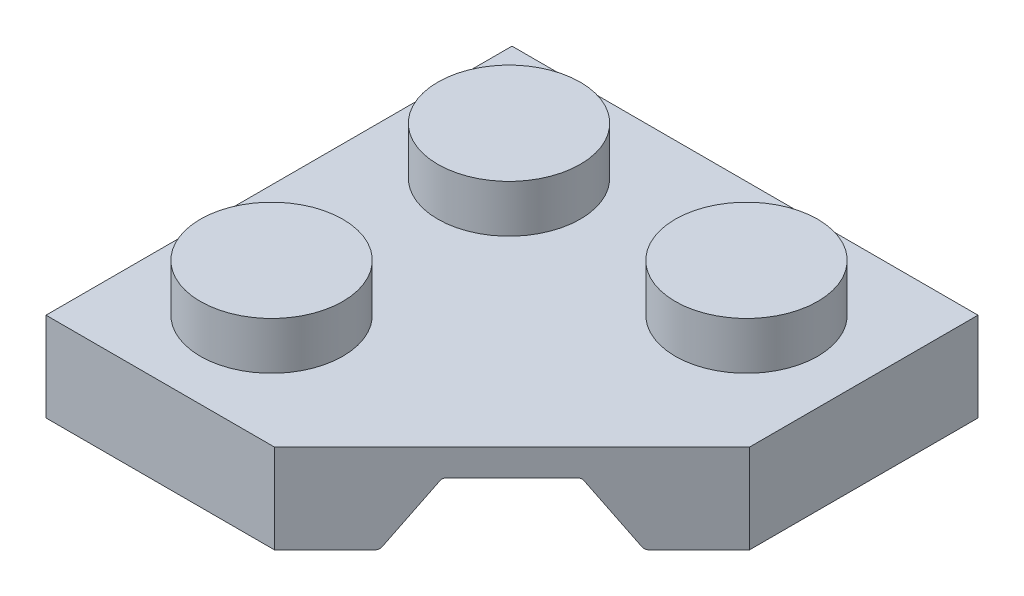
ISO-10303-21;
HEADER;
FILE_DESCRIPTION(('STEP AP214'),'2;1');
FILE_NAME('part.step','',(''),(''),'','','');
FILE_SCHEMA(('AUTOMOTIVE_DESIGN { 1 0 10303 214 1 1 1 1 }'));
ENDSEC;
DATA;
#1=APPLICATION_CONTEXT('core data for automotive mechanical design processes');
#2=APPLICATION_PROTOCOL_DEFINITION('international standard','automotive_design',2000,#1);
#3=PRODUCT_CONTEXT('',#1,'mechanical');
#4=PRODUCT('Part','Part','',(#3));
#5=PRODUCT_RELATED_PRODUCT_CATEGORY('part','',(#4));
#6=PRODUCT_DEFINITION_FORMATION('','',#4);
#7=PRODUCT_DEFINITION_CONTEXT('part definition',#1,'design');
#8=PRODUCT_DEFINITION('design','',#6,#7);
#9=PRODUCT_DEFINITION_SHAPE('','',#8);
#10=(LENGTH_UNIT() NAMED_UNIT(*) SI_UNIT(.MILLI.,.METRE.));
#11=(NAMED_UNIT(*) PLANE_ANGLE_UNIT() SI_UNIT($,.RADIAN.));
#12=(NAMED_UNIT(*) SI_UNIT($,.STERADIAN.) SOLID_ANGLE_UNIT());
#13=UNCERTAINTY_MEASURE_WITH_UNIT(LENGTH_MEASURE(1.E-05),#10,'distance_accuracy_value','');
#14=(GEOMETRIC_REPRESENTATION_CONTEXT(3) GLOBAL_UNCERTAINTY_ASSIGNED_CONTEXT((#13)) GLOBAL_UNIT_ASSIGNED_CONTEXT((#10,
#11,#12)) REPRESENTATION_CONTEXT('',''));
#15=CARTESIAN_POINT('',(0.,0.,0.));
#16=DIRECTION('',(0.,0.,1.));
#17=DIRECTION('',(1.,0.,0.));
#18=AXIS2_PLACEMENT_3D('',#15,#16,#17);
#19=CARTESIAN_POINT('',(-1.15,21.7232539419353,7.15));
#20=DIRECTION('',(0.707106781186547,0.,0.707106781186547));
#21=DIRECTION('',(0.707106781186548,0.,-0.707106781186548));
#22=AXIS2_PLACEMENT_3D('',#19,#20,#21);
#23=PLANE('',#22);
#24=DIRECTION('',(-0.707106781186547,0.,0.707106781186547));
#25=VECTOR('',#24,1.);
#26=CARTESIAN_POINT('',(-1.15,-1.5,7.15));
#27=LINE('',#26,#25);
#28=CARTESIAN_POINT('',(7.15,-1.5,-1.15));
#29=VERTEX_POINT('',#28);
#30=CARTESIAN_POINT('',(5.30648287030593,-1.5,0.693517129694073));
#31=VERTEX_POINT('',#30);
#32=EDGE_CURVE('E342',#29,#31,#27,.T.);
#33=ORIENTED_EDGE('',*,*,#32,.T.);
#34=CARTESIAN_POINT('',(5.30648287030593,-1.3,0.693517129694073));
#35=DIRECTION('',(0.707106781186547,0.,0.707106781186547));
#36=DIRECTION('',(0.707106781186548,0.,-0.707106781186548));
#37=AXIS2_PLACEMENT_3D('',#34,#35,#36);
#38=CIRCLE('',#37,0.2);
#39=CARTESIAN_POINT('',(5.19140357919218,-1.41624763874382,0.808596420807821));
#40=VERTEX_POINT('',#39);
#41=EDGE_CURVE('E248',#31,#40,#38,.F.);
#42=ORIENTED_EDGE('',*,*,#41,.T.);
#43=DIRECTION('',(-0.410997468263393,0.813733471206735,0.410997468263393));
#44=VECTOR('',#43,1.);
#45=CARTESIAN_POINT('',(-4.68979285748255,18.1475231797615,10.6897928574826));
#46=LINE('',#45,#44);
#47=CARTESIAN_POINT('',(4.21534606824754,0.516247638743816,1.78465393175246));
#48=VERTEX_POINT('',#47);
#49=EDGE_CURVE('E275',#40,#48,#46,.T.);
#50=ORIENTED_EDGE('',*,*,#49,.T.);
#51=CARTESIAN_POINT('',(4.10026677713379,0.4,1.89973322286621));
#52=DIRECTION('',(0.707106781186547,0.,0.707106781186547));
#53=DIRECTION('',(0.707106781186548,0.,-0.707106781186548));
#54=AXIS2_PLACEMENT_3D('',#51,#52,#53);
#55=CIRCLE('',#54,0.2);
#56=CARTESIAN_POINT('',(4.10026677713379,0.6,1.89973322286621));
#57=VERTEX_POINT('',#56);
#58=EDGE_CURVE('E260',#48,#57,#55,.T.);
#59=ORIENTED_EDGE('',*,*,#58,.T.);
#60=DIRECTION('',(0.707106781186548,0.,-0.707106781186548));
#61=VECTOR('',#60,1.);
#62=CARTESIAN_POINT('',(-1.15,0.6,7.15));
#63=LINE('',#62,#61);
#64=CARTESIAN_POINT('',(7.15,0.6,-1.15));
#65=VERTEX_POINT('',#64);
#66=EDGE_CURVE('E56',#57,#65,#63,.T.);
#67=ORIENTED_EDGE('',*,*,#66,.T.);
#68=DIRECTION('',(0.,-1.,0.));
#69=VECTOR('',#68,1.);
#70=CARTESIAN_POINT('',(7.15,21.7232539419353,-1.15));
#71=LINE('',#70,#69);
#72=EDGE_CURVE('E353',#65,#29,#71,.T.);
#73=ORIENTED_EDGE('',*,*,#72,.T.);
#74=EDGE_LOOP('',(#33,#42,#50,#59,#67,#73));
#75=FACE_BOUND('',#74,.T.);
#76=ADVANCED_FACE('F41',(#75),#23,.F.);
#77=CARTESIAN_POINT('',(-4.05,3.1,4.05000000000001));
#78=DIRECTION('',(0.,1.,0.));
#79=DIRECTION('',(0.,0.,1.));
#80=AXIS2_PLACEMENT_3D('',#77,#78,#79);
#81=PLANE('',#80);
#82=CARTESIAN_POINT('',(-4.05,3.1,4.05000000000001));
#83=DIRECTION('',(0.,1.,0.));
#84=DIRECTION('',(0.,0.,1.));
#85=AXIS2_PLACEMENT_3D('',#82,#83,#84);
#86=CIRCLE('',#85,2.4);
#87=CARTESIAN_POINT('',(-4.05,3.1,6.45));
#88=VERTEX_POINT('',#87);
#89=EDGE_CURVE('E228',#88,#88,#86,.T.);
#90=ORIENTED_EDGE('',*,*,#89,.T.);
#91=EDGE_LOOP('',(#90));
#92=FACE_BOUND('',#91,.T.);
#93=ADVANCED_FACE('F417',(#92),#81,.T.);
#94=CARTESIAN_POINT('',(-4.05,3.1,4.05000000000001));
#95=DIRECTION('',(0.,-1.,0.));
#96=DIRECTION('',(0.,0.,-1.));
#97=AXIS2_PLACEMENT_3D('',#94,#95,#96);
#98=CYLINDRICAL_SURFACE('',#97,2.4);
#99=ORIENTED_EDGE('',*,*,#89,.F.);
#100=EDGE_LOOP('',(#99));
#101=FACE_BOUND('',#100,.T.);
#102=CARTESIAN_POINT('',(-4.05,1.5,4.05000000000001));
#103=DIRECTION('',(0.,-1.,0.));
#104=DIRECTION('',(0.,0.,-1.));
#105=AXIS2_PLACEMENT_3D('',#102,#103,#104);
#106=CIRCLE('',#105,2.4);
#107=CARTESIAN_POINT('',(-4.05,1.5,1.65000000000001));
#108=VERTEX_POINT('',#107);
#109=EDGE_CURVE('E225',#108,#108,#106,.F.);
#110=ORIENTED_EDGE('',*,*,#109,.T.);
#111=EDGE_LOOP('',(#110));
#112=FACE_BOUND('',#111,.T.);
#113=ADVANCED_FACE('F422',(#101,#112),#98,.T.);
#114=CARTESIAN_POINT('',(7.85,1.5,7.85));
#115=DIRECTION('',(-1.,0.,0.));
#116=DIRECTION('',(0.,0.,1.));
#117=AXIS2_PLACEMENT_3D('',#114,#115,#116);
#118=PLANE('',#117);
#119=DIRECTION('',(0.,0.,-1.));
#120=VECTOR('',#119,1.);
#121=CARTESIAN_POINT('',(7.85,1.5,7.85));
#122=LINE('',#121,#120);
#123=CARTESIAN_POINT('',(7.85,1.5,-0.152943725152281));
#124=VERTEX_POINT('',#123);
#125=CARTESIAN_POINT('',(7.85,1.5,-7.85));
#126=VERTEX_POINT('',#125);
#127=EDGE_CURVE('E187',#124,#126,#122,.T.);
#128=ORIENTED_EDGE('',*,*,#127,.F.);
#129=DIRECTION('',(0.,-1.,0.));
#130=VECTOR('',#129,1.);
#131=CARTESIAN_POINT('',(7.85,3.1,-0.152943725152281));
#132=LINE('',#131,#130);
#133=CARTESIAN_POINT('',(7.85,-1.5,-0.152943725152281));
#134=VERTEX_POINT('',#133);
#135=EDGE_CURVE('E169',#124,#134,#132,.T.);
#136=ORIENTED_EDGE('',*,*,#135,.T.);
#137=DIRECTION('',(0.,0.,-1.));
#138=VECTOR('',#137,1.);
#139=CARTESIAN_POINT('',(7.85,-1.5,7.85));
#140=LINE('',#139,#138);
#141=CARTESIAN_POINT('',(7.85,-1.5,-7.85));
#142=VERTEX_POINT('',#141);
#143=EDGE_CURVE('E185',#134,#142,#140,.T.);
#144=ORIENTED_EDGE('',*,*,#143,.T.);
#145=DIRECTION('',(0.,-1.,0.));
#146=VECTOR('',#145,1.);
#147=CARTESIAN_POINT('',(7.85,1.5,-7.85));
#148=LINE('',#147,#146);
#149=EDGE_CURVE('E217',#126,#142,#148,.T.);
#150=ORIENTED_EDGE('',*,*,#149,.F.);
#151=EDGE_LOOP('',(#128,#136,#144,#150));
#152=FACE_BOUND('',#151,.T.);
#153=ADVANCED_FACE('F183',(#152),#118,.F.);
#154=CARTESIAN_POINT('',(-7.85,1.5,-7.85));
#155=DIRECTION('',(0.,0.,1.));
#156=DIRECTION('',(1.,0.,0.));
#157=AXIS2_PLACEMENT_3D('',#154,#155,#156);
#158=PLANE('',#157);
#159=DIRECTION('',(-1.,0.,0.));
#160=VECTOR('',#159,1.);
#161=CARTESIAN_POINT('',(-7.85,-1.5,-7.85));
#162=LINE('',#161,#160);
#163=CARTESIAN_POINT('',(-7.85,-1.5,-7.85));
#164=VERTEX_POINT('',#163);
#165=EDGE_CURVE('E194',#142,#164,#162,.T.);
#166=ORIENTED_EDGE('',*,*,#165,.T.);
#167=DIRECTION('',(0.,-1.,0.));
#168=VECTOR('',#167,1.);
#169=CARTESIAN_POINT('',(-7.85,1.5,-7.85));
#170=LINE('',#169,#168);
#171=CARTESIAN_POINT('',(-7.85,1.5,-7.85));
#172=VERTEX_POINT('',#171);
#173=EDGE_CURVE('E214',#172,#164,#170,.T.);
#174=ORIENTED_EDGE('',*,*,#173,.F.);
#175=DIRECTION('',(-1.,0.,0.));
#176=VECTOR('',#175,1.);
#177=CARTESIAN_POINT('',(-7.85,1.5,-7.85));
#178=LINE('',#177,#176);
#179=EDGE_CURVE('E361',#126,#172,#178,.T.);
#180=ORIENTED_EDGE('',*,*,#179,.F.);
#181=ORIENTED_EDGE('',*,*,#149,.T.);
#182=EDGE_LOOP('',(#166,#174,#180,#181));
#183=FACE_BOUND('',#182,.T.);
#184=ADVANCED_FACE('F690',(#183),#158,.F.);
#185=CARTESIAN_POINT('',(-7.85,1.5,7.85));
#186=DIRECTION('',(1.,0.,0.));
#187=DIRECTION('',(0.,0.,-1.));
#188=AXIS2_PLACEMENT_3D('',#185,#186,#187);
#189=PLANE('',#188);
#190=DIRECTION('',(0.,0.,1.));
#191=VECTOR('',#190,1.);
#192=CARTESIAN_POINT('',(-7.85,-1.5,7.85));
#193=LINE('',#192,#191);
#194=CARTESIAN_POINT('',(-7.85,-1.5,7.85));
#195=VERTEX_POINT('',#194);
#196=EDGE_CURVE('E198',#164,#195,#193,.T.);
#197=ORIENTED_EDGE('',*,*,#196,.T.);
#198=DIRECTION('',(0.,-1.,0.));
#199=VECTOR('',#198,1.);
#200=CARTESIAN_POINT('',(-7.85,1.5,7.85));
#201=LINE('',#200,#199);
#202=CARTESIAN_POINT('',(-7.85,1.5,7.85));
#203=VERTEX_POINT('',#202);
#204=EDGE_CURVE('E211',#203,#195,#201,.T.);
#205=ORIENTED_EDGE('',*,*,#204,.F.);
#206=DIRECTION('',(0.,0.,1.));
#207=VECTOR('',#206,1.);
#208=CARTESIAN_POINT('',(-7.85,1.5,7.85));
#209=LINE('',#208,#207);
#210=EDGE_CURVE('E362',#172,#203,#209,.T.);
#211=ORIENTED_EDGE('',*,*,#210,.F.);
#212=ORIENTED_EDGE('',*,*,#173,.T.);
#213=EDGE_LOOP('',(#197,#205,#211,#212));
#214=FACE_BOUND('',#213,.T.);
#215=ADVANCED_FACE('F683',(#214),#189,.F.);
#216=CARTESIAN_POINT('',(-7.85,1.5,7.85));
#217=DIRECTION('',(0.,0.,-1.));
#218=DIRECTION('',(-1.,0.,0.));
#219=AXIS2_PLACEMENT_3D('',#216,#217,#218);
#220=PLANE('',#219);
#221=DIRECTION('',(1.,0.,0.));
#222=VECTOR('',#221,1.);
#223=CARTESIAN_POINT('',(-7.85,-1.5,7.85));
#224=LINE('',#223,#222);
#225=CARTESIAN_POINT('',(-0.152943725152292,-1.5,7.85));
#226=VERTEX_POINT('',#225);
#227=EDGE_CURVE('E208',#195,#226,#224,.T.);
#228=ORIENTED_EDGE('',*,*,#227,.T.);
#229=DIRECTION('',(0.,-1.,0.));
#230=VECTOR('',#229,1.);
#231=CARTESIAN_POINT('',(-0.152943725152292,3.1,7.85));
#232=LINE('',#231,#230);
#233=CARTESIAN_POINT('',(-0.152943725152292,1.5,7.85));
#234=VERTEX_POINT('',#233);
#235=EDGE_CURVE('E189',#234,#226,#232,.T.);
#236=ORIENTED_EDGE('',*,*,#235,.F.);
#237=DIRECTION('',(1.,0.,0.));
#238=VECTOR('',#237,1.);
#239=CARTESIAN_POINT('',(-7.85,1.5,7.85));
#240=LINE('',#239,#238);
#241=EDGE_CURVE('E204',#203,#234,#240,.T.);
#242=ORIENTED_EDGE('',*,*,#241,.F.);
#243=ORIENTED_EDGE('',*,*,#204,.T.);
#244=EDGE_LOOP('',(#228,#236,#242,#243));
#245=FACE_BOUND('',#244,.T.);
#246=ADVANCED_FACE('F372',(#245),#220,.F.);
#247=CARTESIAN_POINT('',(0.,1.5,0.));
#248=DIRECTION('',(0.,-1.,0.));
#249=DIRECTION('',(0.,0.,-1.));
#250=AXIS2_PLACEMENT_3D('',#247,#248,#249);
#251=PLANE('',#250);
#252=CARTESIAN_POINT('',(-4.05,1.5,-3.94999999999999));
#253=DIRECTION('',(0.,-1.,0.));
#254=DIRECTION('',(0.,0.,-1.));
#255=AXIS2_PLACEMENT_3D('',#252,#253,#254);
#256=CIRCLE('',#255,2.4);
#257=CARTESIAN_POINT('',(-4.05,1.5,-6.34999999999999));
#258=VERTEX_POINT('',#257);
#259=EDGE_CURVE('E222',#258,#258,#256,.F.);
#260=ORIENTED_EDGE('',*,*,#259,.F.);
#261=EDGE_LOOP('',(#260));
#262=FACE_BOUND('',#261,.T.);
#263=CARTESIAN_POINT('',(3.95,1.5,-3.94999999999999));
#264=DIRECTION('',(0.,-1.,0.));
#265=DIRECTION('',(0.,0.,-1.));
#266=AXIS2_PLACEMENT_3D('',#263,#264,#265);
#267=CIRCLE('',#266,2.4);
#268=CARTESIAN_POINT('',(3.95,1.5,-6.34999999999999));
#269=VERTEX_POINT('',#268);
#270=EDGE_CURVE('E219',#269,#269,#267,.F.);
#271=ORIENTED_EDGE('',*,*,#270,.F.);
#272=EDGE_LOOP('',(#271));
#273=FACE_BOUND('',#272,.T.);
#274=ORIENTED_EDGE('',*,*,#241,.T.);
#275=DIRECTION('',(0.707106781186548,0.,-0.707106781186547));
#276=VECTOR('',#275,1.);
#277=CARTESIAN_POINT('',(3.84852813742386,1.5,3.84852813742386));
#278=LINE('',#277,#276);
#279=EDGE_CURVE('E188',#234,#124,#278,.T.);
#280=ORIENTED_EDGE('',*,*,#279,.T.);
#281=ORIENTED_EDGE('',*,*,#127,.T.);
#282=ORIENTED_EDGE('',*,*,#179,.T.);
#283=ORIENTED_EDGE('',*,*,#210,.T.);
#284=EDGE_LOOP('',(#274,#280,#281,#282,#283));
#285=FACE_BOUND('',#284,.T.);
#286=ORIENTED_EDGE('',*,*,#109,.F.);
#287=EDGE_LOOP('',(#286));
#288=FACE_BOUND('',#287,.T.);
#289=ADVANCED_FACE('F368',(#262,#273,#285,#288),#251,.F.);
#290=CARTESIAN_POINT('',(0.,-1.5,0.));
#291=DIRECTION('',(0.,-1.,0.));
#292=DIRECTION('',(0.,0.,-1.));
#293=AXIS2_PLACEMENT_3D('',#290,#291,#292);
#294=PLANE('',#293);
#295=CARTESIAN_POINT('',(0.693517129694063,-1.5,5.30648287030594));
#296=VERTEX_POINT('',#295);
#297=CARTESIAN_POINT('',(-1.15,-1.5,7.15));
#298=VERTEX_POINT('',#297);
#299=EDGE_CURVE('E341',#296,#298,#27,.T.);
#300=ORIENTED_EDGE('',*,*,#299,.F.);
#301=DIRECTION('',(-0.707106781186547,0.,-0.707106781186548));
#302=VECTOR('',#301,1.);
#303=CARTESIAN_POINT('',(1.54204526711792,-1.5,6.1550110077298));
#304=LINE('',#303,#302);
#305=CARTESIAN_POINT('',(1.54204526711792,-1.5,6.15501100772979));
#306=VERTEX_POINT('',#305);
#307=EDGE_CURVE('E243',#296,#306,#304,.F.);
#308=ORIENTED_EDGE('',*,*,#307,.T.);
#309=DIRECTION('',(0.707106781186548,0.,-0.707106781186547));
#310=VECTOR('',#309,1.);
#311=CARTESIAN_POINT('',(-0.152943725152292,-1.5,7.85));
#312=LINE('',#311,#310);
#313=EDGE_CURVE('E178',#226,#306,#312,.T.);
#314=ORIENTED_EDGE('',*,*,#313,.F.);
#315=ORIENTED_EDGE('',*,*,#227,.F.);
#316=ORIENTED_EDGE('',*,*,#196,.F.);
#317=ORIENTED_EDGE('',*,*,#165,.F.);
#318=ORIENTED_EDGE('',*,*,#143,.F.);
#319=CARTESIAN_POINT('',(6.15501100772978,-1.5,1.54204526711793));
#320=VERTEX_POINT('',#319);
#321=EDGE_CURVE('E165',#320,#134,#312,.T.);
#322=ORIENTED_EDGE('',*,*,#321,.F.);
#323=DIRECTION('',(-0.707106781186547,0.,-0.707106781186548));
#324=VECTOR('',#323,1.);
#325=CARTESIAN_POINT('',(5.30648287030593,-1.5,0.693517129694076));
#326=LINE('',#325,#324);
#327=EDGE_CURVE('E241',#320,#31,#326,.T.);
#328=ORIENTED_EDGE('',*,*,#327,.T.);
#329=ORIENTED_EDGE('',*,*,#32,.F.);
#330=DIRECTION('',(0.,0.,1.));
#331=VECTOR('',#330,1.);
#332=CARTESIAN_POINT('',(7.15,-1.5,-1.15));
#333=LINE('',#332,#331);
#334=CARTESIAN_POINT('',(7.15,-1.5,-7.15));
#335=VERTEX_POINT('',#334);
#336=EDGE_CURVE('E338',#335,#29,#333,.T.);
#337=ORIENTED_EDGE('',*,*,#336,.F.);
#338=DIRECTION('',(1.,0.,0.));
#339=VECTOR('',#338,1.);
#340=CARTESIAN_POINT('',(7.15,-1.5,-7.15));
#341=LINE('',#340,#339);
#342=CARTESIAN_POINT('',(-7.15,-1.5,-7.15));
#343=VERTEX_POINT('',#342);
#344=EDGE_CURVE('E335',#343,#335,#341,.T.);
#345=ORIENTED_EDGE('',*,*,#344,.F.);
#346=DIRECTION('',(0.,0.,-1.));
#347=VECTOR('',#346,1.);
#348=CARTESIAN_POINT('',(-7.15,-1.5,-7.15));
#349=LINE('',#348,#347);
#350=CARTESIAN_POINT('',(-7.15,-1.5,7.15));
#351=VERTEX_POINT('',#350);
#352=EDGE_CURVE('E325',#351,#343,#349,.T.);
#353=ORIENTED_EDGE('',*,*,#352,.F.);
#354=DIRECTION('',(-1.,0.,0.));
#355=VECTOR('',#354,1.);
#356=CARTESIAN_POINT('',(-7.15,-1.5,7.15));
#357=LINE('',#356,#355);
#358=EDGE_CURVE('E345',#298,#351,#357,.T.);
#359=ORIENTED_EDGE('',*,*,#358,.F.);
#360=EDGE_LOOP('',(#300,#308,#314,#315,#316,#317,#318,#322,#328,#329,#337,#345,#353,#359));
#361=FACE_BOUND('',#360,.T.);
#362=ADVANCED_FACE('F192',(#361),#294,.T.);
#363=CARTESIAN_POINT('',(3.95,3.1,-3.94999999999999));
#364=DIRECTION('',(0.,-1.,0.));
#365=DIRECTION('',(0.,0.,-1.));
#366=AXIS2_PLACEMENT_3D('',#363,#364,#365);
#367=CYLINDRICAL_SURFACE('',#366,2.4);
#368=CARTESIAN_POINT('',(3.95,3.1,-3.94999999999999));
#369=DIRECTION('',(0.,1.,0.));
#370=DIRECTION('',(0.,0.,1.));
#371=AXIS2_PLACEMENT_3D('',#368,#369,#370);
#372=CIRCLE('',#371,2.4);
#373=CARTESIAN_POINT('',(3.95,3.1,-1.55));
#374=VERTEX_POINT('',#373);
#375=EDGE_CURVE('E196',#374,#374,#372,.T.);
#376=ORIENTED_EDGE('',*,*,#375,.F.);
#377=EDGE_LOOP('',(#376));
#378=FACE_BOUND('',#377,.T.);
#379=ORIENTED_EDGE('',*,*,#270,.T.);
#380=EDGE_LOOP('',(#379));
#381=FACE_BOUND('',#380,.T.);
#382=ADVANCED_FACE('F653',(#378,#381),#367,.T.);
#383=CARTESIAN_POINT('',(3.95,3.1,-3.94999999999999));
#384=DIRECTION('',(0.,1.,0.));
#385=DIRECTION('',(0.,0.,1.));
#386=AXIS2_PLACEMENT_3D('',#383,#384,#385);
#387=PLANE('',#386);
#388=ORIENTED_EDGE('',*,*,#375,.T.);
#389=EDGE_LOOP('',(#388));
#390=FACE_BOUND('',#389,.T.);
#391=ADVANCED_FACE('F435',(#390),#387,.T.);
#392=CARTESIAN_POINT('',(-7.15,21.7232539419353,-7.15));
#393=DIRECTION('',(-1.,0.,0.));
#394=DIRECTION('',(0.,0.,1.));
#395=AXIS2_PLACEMENT_3D('',#392,#393,#394);
#396=PLANE('',#395);
#397=DIRECTION('',(0.,0.,1.));
#398=VECTOR('',#397,1.);
#399=CARTESIAN_POINT('',(-7.15,0.6,-7.15));
#400=LINE('',#399,#398);
#401=CARTESIAN_POINT('',(-7.15,0.6,-7.15));
#402=VERTEX_POINT('',#401);
#403=CARTESIAN_POINT('',(-7.15,0.6,7.15));
#404=VERTEX_POINT('',#403);
#405=EDGE_CURVE('E332',#402,#404,#400,.T.);
#406=ORIENTED_EDGE('',*,*,#405,.T.);
#407=DIRECTION('',(0.,-1.,0.));
#408=VECTOR('',#407,1.);
#409=CARTESIAN_POINT('',(-7.15,21.7232539419353,7.15));
#410=LINE('',#409,#408);
#411=EDGE_CURVE('E328',#404,#351,#410,.T.);
#412=ORIENTED_EDGE('',*,*,#411,.T.);
#413=ORIENTED_EDGE('',*,*,#352,.T.);
#414=DIRECTION('',(0.,-1.,0.));
#415=VECTOR('',#414,1.);
#416=CARTESIAN_POINT('',(-7.15,21.7232539419353,-7.15));
#417=LINE('',#416,#415);
#418=EDGE_CURVE('E348',#402,#343,#417,.T.);
#419=ORIENTED_EDGE('',*,*,#418,.F.);
#420=EDGE_LOOP('',(#406,#412,#413,#419));
#421=FACE_BOUND('',#420,.T.);
#422=ADVANCED_FACE('F389',(#421),#396,.F.);
#423=CARTESIAN_POINT('',(-7.15,21.7232539419353,7.15));
#424=DIRECTION('',(0.,0.,1.));
#425=DIRECTION('',(1.,0.,0.));
#426=AXIS2_PLACEMENT_3D('',#423,#424,#425);
#427=PLANE('',#426);
#428=DIRECTION('',(1.,0.,0.));
#429=VECTOR('',#428,1.);
#430=CARTESIAN_POINT('',(-7.15,0.6,7.15));
#431=LINE('',#430,#429);
#432=CARTESIAN_POINT('',(-1.15,0.6,7.15));
#433=VERTEX_POINT('',#432);
#434=EDGE_CURVE('E330',#404,#433,#431,.T.);
#435=ORIENTED_EDGE('',*,*,#434,.T.);
#436=DIRECTION('',(0.,-1.,0.));
#437=VECTOR('',#436,1.);
#438=CARTESIAN_POINT('',(-1.15,21.7232539419353,7.15));
#439=LINE('',#438,#437);
#440=EDGE_CURVE('E350',#433,#298,#439,.T.);
#441=ORIENTED_EDGE('',*,*,#440,.T.);
#442=ORIENTED_EDGE('',*,*,#358,.T.);
#443=ORIENTED_EDGE('',*,*,#411,.F.);
#444=EDGE_LOOP('',(#435,#441,#442,#443));
#445=FACE_BOUND('',#444,.T.);
#446=ADVANCED_FACE('F381',(#445),#427,.F.);
#447=DIRECTION('',(-0.410997468263393,-0.813733471206735,0.410997468263393));
#448=VECTOR('',#447,1.);
#449=CARTESIAN_POINT('',(7.88573880342849,12.5957793977428,-1.88573880342849));
#450=LINE('',#449,#448);
#451=CARTESIAN_POINT('',(1.78465393175245,0.516247638743814,4.21534606824755));
#452=VERTEX_POINT('',#451);
#453=CARTESIAN_POINT('',(0.80859642080781,-1.41624763874382,5.19140357919219));
#454=VERTEX_POINT('',#453);
#455=EDGE_CURVE('E266',#452,#454,#450,.T.);
#456=ORIENTED_EDGE('',*,*,#455,.T.);
#457=CARTESIAN_POINT('',(0.693517129694066,-1.3,5.30648287030594));
#458=DIRECTION('',(0.707106781186547,0.,0.707106781186547));
#459=DIRECTION('',(0.707106781186548,0.,-0.707106781186548));
#460=AXIS2_PLACEMENT_3D('',#457,#458,#459);
#461=CIRCLE('',#460,0.2);
#462=EDGE_CURVE('E239',#454,#296,#461,.F.);
#463=ORIENTED_EDGE('',*,*,#462,.T.);
#464=ORIENTED_EDGE('',*,*,#299,.T.);
#465=ORIENTED_EDGE('',*,*,#440,.F.);
#466=CARTESIAN_POINT('',(1.8997332228662,0.6,4.1002667771338));
#467=VERTEX_POINT('',#466);
#468=EDGE_CURVE('E64',#433,#467,#63,.T.);
#469=ORIENTED_EDGE('',*,*,#468,.T.);
#470=CARTESIAN_POINT('',(1.8997332228662,0.4,4.1002667771338));
#471=DIRECTION('',(0.707106781186547,0.,0.707106781186547));
#472=DIRECTION('',(0.707106781186548,0.,-0.707106781186548));
#473=AXIS2_PLACEMENT_3D('',#470,#471,#472);
#474=CIRCLE('',#473,0.2);
#475=EDGE_CURVE('E49',#467,#452,#474,.T.);
#476=ORIENTED_EDGE('',*,*,#475,.T.);
#477=EDGE_LOOP('',(#456,#463,#464,#465,#469,#476));
#478=FACE_BOUND('',#477,.T.);
#479=ADVANCED_FACE('F265',(#478),#23,.F.);
#480=CARTESIAN_POINT('',(7.15,21.7232539419353,-1.15));
#481=DIRECTION('',(1.,0.,0.));
#482=DIRECTION('',(0.,0.,-1.));
#483=AXIS2_PLACEMENT_3D('',#480,#481,#482);
#484=PLANE('',#483);
#485=DIRECTION('',(0.,0.,-1.));
#486=VECTOR('',#485,1.);
#487=CARTESIAN_POINT('',(7.15,0.6,-1.15));
#488=LINE('',#487,#486);
#489=CARTESIAN_POINT('',(7.15,0.6,-7.15));
#490=VERTEX_POINT('',#489);
#491=EDGE_CURVE('E326',#65,#490,#488,.T.);
#492=ORIENTED_EDGE('',*,*,#491,.T.);
#493=DIRECTION('',(0.,-1.,0.));
#494=VECTOR('',#493,1.);
#495=CARTESIAN_POINT('',(7.15,21.7232539419353,-7.15));
#496=LINE('',#495,#494);
#497=EDGE_CURVE('E355',#490,#335,#496,.T.);
#498=ORIENTED_EDGE('',*,*,#497,.T.);
#499=ORIENTED_EDGE('',*,*,#336,.T.);
#500=ORIENTED_EDGE('',*,*,#72,.F.);
#501=EDGE_LOOP('',(#492,#498,#499,#500));
#502=FACE_BOUND('',#501,.T.);
#503=ADVANCED_FACE('F397',(#502),#484,.F.);
#504=CARTESIAN_POINT('',(7.15,21.7232539419353,-7.15));
#505=DIRECTION('',(0.,0.,-1.));
#506=DIRECTION('',(-1.,0.,0.));
#507=AXIS2_PLACEMENT_3D('',#504,#505,#506);
#508=PLANE('',#507);
#509=DIRECTION('',(-1.,0.,0.));
#510=VECTOR('',#509,1.);
#511=CARTESIAN_POINT('',(7.15,0.6,-7.15));
#512=LINE('',#511,#510);
#513=EDGE_CURVE('E201',#490,#402,#512,.T.);
#514=ORIENTED_EDGE('',*,*,#513,.T.);
#515=ORIENTED_EDGE('',*,*,#418,.T.);
#516=ORIENTED_EDGE('',*,*,#344,.T.);
#517=ORIENTED_EDGE('',*,*,#497,.F.);
#518=EDGE_LOOP('',(#514,#515,#516,#517));
#519=FACE_BOUND('',#518,.T.);
#520=ADVANCED_FACE('F391',(#519),#508,.F.);
#521=CARTESIAN_POINT('',(0.,0.6,0.));
#522=DIRECTION('',(0.,-1.,0.));
#523=DIRECTION('',(0.,0.,-1.));
#524=AXIS2_PLACEMENT_3D('',#521,#522,#523);
#525=PLANE('',#524);
#526=ORIENTED_EDGE('',*,*,#66,.F.);
#527=DIRECTION('',(-0.707106781186547,0.,-0.707106781186548));
#528=VECTOR('',#527,1.);
#529=CARTESIAN_POINT('',(1.10026677713379,0.6,-1.10026677713379));
#530=LINE('',#529,#528);
#531=CARTESIAN_POINT('',(4.94879491455765,0.6,2.74826136029006));
#532=VERTEX_POINT('',#531);
#533=EDGE_CURVE('E258',#57,#532,#530,.F.);
#534=ORIENTED_EDGE('',*,*,#533,.T.);
#535=DIRECTION('',(-0.707106781186548,0.,0.707106781186547));
#536=VECTOR('',#535,1.);
#537=CARTESIAN_POINT('',(2.6754833995939,0.6,5.02157287525381));
#538=LINE('',#537,#536);
#539=CARTESIAN_POINT('',(2.74826136029005,0.6,4.94879491455766));
#540=VERTEX_POINT('',#539);
#541=EDGE_CURVE('E281',#532,#540,#538,.T.);
#542=ORIENTED_EDGE('',*,*,#541,.T.);
#543=DIRECTION('',(-0.707106781186547,0.,-0.707106781186548));
#544=VECTOR('',#543,1.);
#545=CARTESIAN_POINT('',(-1.1002667771338,0.6,1.1002667771338));
#546=LINE('',#545,#544);
#547=EDGE_CURVE('E255',#540,#467,#546,.T.);
#548=ORIENTED_EDGE('',*,*,#547,.T.);
#549=ORIENTED_EDGE('',*,*,#468,.F.);
#550=ORIENTED_EDGE('',*,*,#434,.F.);
#551=ORIENTED_EDGE('',*,*,#405,.F.);
#552=ORIENTED_EDGE('',*,*,#513,.F.);
#553=ORIENTED_EDGE('',*,*,#491,.F.);
#554=EDGE_LOOP('',(#526,#534,#542,#548,#549,#550,#551,#552,#553));
#555=FACE_BOUND('',#554,.T.);
#556=CARTESIAN_POINT('',(-3.95,0.6,-4.05));
#557=DIRECTION('',(0.,-1.,0.));
#558=DIRECTION('',(0.,0.,-1.));
#559=AXIS2_PLACEMENT_3D('',#556,#557,#558);
#560=CIRCLE('',#559,1.3);
#561=CARTESIAN_POINT('',(-3.95,0.6,-5.35));
#562=VERTEX_POINT('',#561);
#563=EDGE_CURVE('E299',#562,#562,#560,.T.);
#564=ORIENTED_EDGE('',*,*,#563,.F.);
#565=EDGE_LOOP('',(#564));
#566=FACE_BOUND('',#565,.T.);
#567=CARTESIAN_POINT('',(4.05,0.6,-4.05));
#568=DIRECTION('',(0.,-1.,0.));
#569=DIRECTION('',(0.,0.,-1.));
#570=AXIS2_PLACEMENT_3D('',#567,#568,#569);
#571=CIRCLE('',#570,1.3);
#572=CARTESIAN_POINT('',(4.05,0.6,-5.35));
#573=VERTEX_POINT('',#572);
#574=EDGE_CURVE('E294',#573,#573,#571,.T.);
#575=ORIENTED_EDGE('',*,*,#574,.F.);
#576=EDGE_LOOP('',(#575));
#577=FACE_BOUND('',#576,.T.);
#578=CARTESIAN_POINT('',(-3.95,0.6,3.95));
#579=DIRECTION('',(0.,-1.,0.));
#580=DIRECTION('',(0.,0.,-1.));
#581=AXIS2_PLACEMENT_3D('',#578,#579,#580);
#582=CIRCLE('',#581,1.3);
#583=CARTESIAN_POINT('',(-3.95,0.6,2.65));
#584=VERTEX_POINT('',#583);
#585=EDGE_CURVE('E298',#584,#584,#582,.T.);
#586=ORIENTED_EDGE('',*,*,#585,.F.);
#587=EDGE_LOOP('',(#586));
#588=FACE_BOUND('',#587,.T.);
#589=CARTESIAN_POINT('',(0.,0.6,0.));
#590=DIRECTION('',(0.,-1.,0.));
#591=DIRECTION('',(0.,0.,-1.));
#592=AXIS2_PLACEMENT_3D('',#589,#590,#591);
#593=CIRCLE('',#592,1.5);
#594=CARTESIAN_POINT('',(0.,0.6,-1.5));
#595=VERTEX_POINT('',#594);
#596=EDGE_CURVE('E316',#595,#595,#593,.T.);
#597=ORIENTED_EDGE('',*,*,#596,.F.);
#598=EDGE_LOOP('',(#597));
#599=FACE_BOUND('',#598,.T.);
#600=ADVANCED_FACE('F283',(#555,#566,#577,#588,#599),#525,.T.);
#601=CARTESIAN_POINT('',(-0.152943725152292,3.1,7.85));
#602=DIRECTION('',(-0.707106781186547,0.,-0.707106781186548));
#603=DIRECTION('',(-0.707106781186548,0.,0.707106781186547));
#604=AXIS2_PLACEMENT_3D('',#601,#602,#603);
#605=PLANE('',#604);
#606=ORIENTED_EDGE('',*,*,#313,.T.);
#607=CARTESIAN_POINT('',(1.54204526711792,-1.3,6.15501100772979));
#608=DIRECTION('',(-0.707106781186547,0.,-0.707106781186548));
#609=DIRECTION('',(-0.707106781186548,0.,0.707106781186547));
#610=AXIS2_PLACEMENT_3D('',#607,#608,#609);
#611=CIRCLE('',#610,0.2);
#612=CARTESIAN_POINT('',(1.65712455823167,-1.41624763874382,6.03993171661604));
#613=VERTEX_POINT('',#612);
#614=EDGE_CURVE('E246',#306,#613,#611,.F.);
#615=ORIENTED_EDGE('',*,*,#614,.T.);
#616=DIRECTION('',(-0.410997468263393,-0.813733471206735,0.410997468263393));
#617=VECTOR('',#616,1.);
#618=CARTESIAN_POINT('',(2.6754833995939,0.600000000000001,5.02157287525381));
#619=LINE('',#618,#617);
#620=CARTESIAN_POINT('',(2.6331820691763,0.51624763874382,5.06387420567141));
#621=VERTEX_POINT('',#620);
#622=EDGE_CURVE('E276',#621,#613,#619,.T.);
#623=ORIENTED_EDGE('',*,*,#622,.F.);
#624=CARTESIAN_POINT('',(2.74826136029005,0.4,4.94879491455766));
#625=DIRECTION('',(-0.707106781186547,0.,-0.707106781186548));
#626=DIRECTION('',(-0.707106781186548,0.,0.707106781186547));
#627=AXIS2_PLACEMENT_3D('',#624,#625,#626);
#628=CIRCLE('',#627,0.2);
#629=EDGE_CURVE('E12',#621,#540,#628,.T.);
#630=ORIENTED_EDGE('',*,*,#629,.T.);
#631=ORIENTED_EDGE('',*,*,#541,.F.);
#632=CARTESIAN_POINT('',(4.94879491455765,0.4,2.74826136029006));
#633=DIRECTION('',(-0.707106781186547,0.,-0.707106781186548));
#634=DIRECTION('',(-0.707106781186548,0.,0.707106781186547));
#635=AXIS2_PLACEMENT_3D('',#632,#633,#634);
#636=CIRCLE('',#635,0.2);
#637=CARTESIAN_POINT('',(5.0638742056714,0.51624763874382,2.63318206917631));
#638=VERTEX_POINT('',#637);
#639=EDGE_CURVE('E262',#532,#638,#636,.T.);
#640=ORIENTED_EDGE('',*,*,#639,.T.);
#641=DIRECTION('',(-0.410997468263393,0.813733471206735,0.410997468263393));
#642=VECTOR('',#641,1.);
#643=CARTESIAN_POINT('',(5.02157287525381,0.599999999999999,2.67548339959391));
#644=LINE('',#643,#642);
#645=CARTESIAN_POINT('',(6.03993171661603,-1.41624763874382,1.65712455823168));
#646=VERTEX_POINT('',#645);
#647=EDGE_CURVE('E286',#646,#638,#644,.T.);
#648=ORIENTED_EDGE('',*,*,#647,.F.);
#649=CARTESIAN_POINT('',(6.15501100772978,-1.3,1.54204526711793));
#650=DIRECTION('',(-0.707106781186547,0.,-0.707106781186548));
#651=DIRECTION('',(-0.707106781186548,0.,0.707106781186547));
#652=AXIS2_PLACEMENT_3D('',#649,#650,#651);
#653=CIRCLE('',#652,0.2);
#654=EDGE_CURVE('E173',#646,#320,#653,.F.);
#655=ORIENTED_EDGE('',*,*,#654,.T.);
#656=ORIENTED_EDGE('',*,*,#321,.T.);
#657=ORIENTED_EDGE('',*,*,#135,.F.);
#658=ORIENTED_EDGE('',*,*,#279,.F.);
#659=ORIENTED_EDGE('',*,*,#235,.T.);
#660=EDGE_LOOP('',(#606,#615,#623,#630,#631,#640,#648,#655,#656,#657,#658,#659));
#661=FACE_BOUND('',#660,.T.);
#662=ADVANCED_FACE('F168',(#661),#605,.F.);
#663=CARTESIAN_POINT('',(-4.05,3.1,-3.94999999999999));
#664=DIRECTION('',(0.,-1.,0.));
#665=DIRECTION('',(0.,0.,-1.));
#666=AXIS2_PLACEMENT_3D('',#663,#664,#665);
#667=CYLINDRICAL_SURFACE('',#666,2.4);
#668=CARTESIAN_POINT('',(-4.05,3.1,-3.94999999999999));
#669=DIRECTION('',(0.,1.,0.));
#670=DIRECTION('',(0.,0.,1.));
#671=AXIS2_PLACEMENT_3D('',#668,#669,#670);
#672=CIRCLE('',#671,2.4);
#673=CARTESIAN_POINT('',(-4.05,3.1,-1.55));
#674=VERTEX_POINT('',#673);
#675=EDGE_CURVE('E179',#674,#674,#672,.T.);
#676=ORIENTED_EDGE('',*,*,#675,.F.);
#677=EDGE_LOOP('',(#676));
#678=FACE_BOUND('',#677,.T.);
#679=ORIENTED_EDGE('',*,*,#259,.T.);
#680=EDGE_LOOP('',(#679));
#681=FACE_BOUND('',#680,.T.);
#682=ADVANCED_FACE('F443',(#678,#681),#667,.T.);
#683=CARTESIAN_POINT('',(-4.05,3.1,-3.94999999999999));
#684=DIRECTION('',(0.,1.,0.));
#685=DIRECTION('',(0.,0.,1.));
#686=AXIS2_PLACEMENT_3D('',#683,#684,#685);
#687=PLANE('',#686);
#688=ORIENTED_EDGE('',*,*,#675,.T.);
#689=EDGE_LOOP('',(#688));
#690=FACE_BOUND('',#689,.T.);
#691=ADVANCED_FACE('F446',(#690),#687,.T.);
#692=CARTESIAN_POINT('',(0.,-5.74264068711929,0.));
#693=DIRECTION('',(0.,1.,0.));
#694=DIRECTION('',(0.,0.,1.));
#695=AXIS2_PLACEMENT_3D('',#692,#693,#694);
#696=CYLINDRICAL_SURFACE('',#695,1.5);
#697=ORIENTED_EDGE('',*,*,#596,.T.);
#698=EDGE_LOOP('',(#697));
#699=FACE_BOUND('',#698,.T.);
#700=CARTESIAN_POINT('',(0.,-1.3,0.));
#701=DIRECTION('',(0.,-1.,0.));
#702=DIRECTION('',(0.,0.,-1.));
#703=AXIS2_PLACEMENT_3D('',#700,#701,#702);
#704=CIRCLE('',#703,1.5);
#705=CARTESIAN_POINT('',(0.,-1.3,-1.5));
#706=VERTEX_POINT('',#705);
#707=EDGE_CURVE('E313',#706,#706,#704,.T.);
#708=ORIENTED_EDGE('',*,*,#707,.F.);
#709=EDGE_LOOP('',(#708));
#710=FACE_BOUND('',#709,.T.);
#711=ADVANCED_FACE('F450',(#699,#710),#696,.T.);
#712=CARTESIAN_POINT('',(0.,-5.74264068711929,0.));
#713=DIRECTION('',(0.,1.,0.));
#714=DIRECTION('',(0.,0.,1.));
#715=AXIS2_PLACEMENT_3D('',#712,#713,#714);
#716=CYLINDRICAL_SURFACE('',#715,1.);
#717=CARTESIAN_POINT('',(0.,0.6,0.));
#718=DIRECTION('',(0.,-1.,0.));
#719=DIRECTION('',(0.,0.,-1.));
#720=AXIS2_PLACEMENT_3D('',#717,#718,#719);
#721=CIRCLE('',#720,1.);
#722=CARTESIAN_POINT('',(0.,0.6,-1.));
#723=VERTEX_POINT('',#722);
#724=EDGE_CURVE('E231',#723,#723,#721,.F.);
#725=ORIENTED_EDGE('',*,*,#724,.T.);
#726=EDGE_LOOP('',(#725));
#727=FACE_BOUND('',#726,.T.);
#728=CARTESIAN_POINT('',(0.,-1.3,0.));
#729=DIRECTION('',(0.,-1.,0.));
#730=DIRECTION('',(0.,0.,-1.));
#731=AXIS2_PLACEMENT_3D('',#728,#729,#730);
#732=CIRCLE('',#731,1.);
#733=CARTESIAN_POINT('',(0.,-1.3,-1.));
#734=VERTEX_POINT('',#733);
#735=EDGE_CURVE('E310',#734,#734,#732,.T.);
#736=ORIENTED_EDGE('',*,*,#735,.T.);
#737=EDGE_LOOP('',(#736));
#738=FACE_BOUND('',#737,.T.);
#739=ADVANCED_FACE('F454',(#727,#738),#716,.F.);
#740=CARTESIAN_POINT('',(0.,-1.3,0.));
#741=DIRECTION('',(0.,-1.,0.));
#742=DIRECTION('',(0.,0.,-1.));
#743=AXIS2_PLACEMENT_3D('',#740,#741,#742);
#744=PLANE('',#743);
#745=ORIENTED_EDGE('',*,*,#735,.F.);
#746=EDGE_LOOP('',(#745));
#747=FACE_BOUND('',#746,.T.);
#748=ORIENTED_EDGE('',*,*,#707,.T.);
#749=EDGE_LOOP('',(#748));
#750=FACE_BOUND('',#749,.T.);
#751=ADVANCED_FACE('F458',(#747,#750),#744,.T.);
#752=ORIENTED_EDGE('',*,*,#724,.F.);
#753=EDGE_LOOP('',(#752));
#754=FACE_BOUND('',#753,.T.);
#755=ADVANCED_FACE('F440',(#754),#525,.T.);
#756=CARTESIAN_POINT('',(-3.95,2.3,3.95));
#757=DIRECTION('',(0.,-1.,0.));
#758=DIRECTION('',(0.,0.,-1.));
#759=AXIS2_PLACEMENT_3D('',#756,#757,#758);
#760=CYLINDRICAL_SURFACE('',#759,1.3);
#761=CARTESIAN_POINT('',(-3.95,2.3,3.95));
#762=DIRECTION('',(0.,-1.,0.));
#763=DIRECTION('',(0.,0.,-1.));
#764=AXIS2_PLACEMENT_3D('',#761,#762,#763);
#765=CIRCLE('',#764,1.3);
#766=CARTESIAN_POINT('',(-3.95,2.3,2.65));
#767=VERTEX_POINT('',#766);
#768=EDGE_CURVE('E307',#767,#767,#765,.T.);
#769=ORIENTED_EDGE('',*,*,#768,.F.);
#770=EDGE_LOOP('',(#769));
#771=FACE_BOUND('',#770,.T.);
#772=ORIENTED_EDGE('',*,*,#585,.T.);
#773=EDGE_LOOP('',(#772));
#774=FACE_BOUND('',#773,.T.);
#775=ADVANCED_FACE('F463',(#771,#774),#760,.F.);
#776=CARTESIAN_POINT('',(-3.95,2.3,3.95));
#777=DIRECTION('',(0.,-1.,0.));
#778=DIRECTION('',(0.,0.,-1.));
#779=AXIS2_PLACEMENT_3D('',#776,#777,#778);
#780=PLANE('',#779);
#781=ORIENTED_EDGE('',*,*,#768,.T.);
#782=EDGE_LOOP('',(#781));
#783=FACE_BOUND('',#782,.T.);
#784=ADVANCED_FACE('F466',(#783),#780,.T.);
#785=CARTESIAN_POINT('',(4.05,2.3,-4.05));
#786=DIRECTION('',(0.,-1.,0.));
#787=DIRECTION('',(0.,0.,-1.));
#788=AXIS2_PLACEMENT_3D('',#785,#786,#787);
#789=CYLINDRICAL_SURFACE('',#788,1.3);
#790=CARTESIAN_POINT('',(4.05,2.3,-4.05));
#791=DIRECTION('',(0.,-1.,0.));
#792=DIRECTION('',(0.,0.,-1.));
#793=AXIS2_PLACEMENT_3D('',#790,#791,#792);
#794=CIRCLE('',#793,1.3);
#795=CARTESIAN_POINT('',(4.05,2.3,-5.35));
#796=VERTEX_POINT('',#795);
#797=EDGE_CURVE('E302',#796,#796,#794,.T.);
#798=ORIENTED_EDGE('',*,*,#797,.F.);
#799=EDGE_LOOP('',(#798));
#800=FACE_BOUND('',#799,.T.);
#801=ORIENTED_EDGE('',*,*,#574,.T.);
#802=EDGE_LOOP('',(#801));
#803=FACE_BOUND('',#802,.T.);
#804=ADVANCED_FACE('F470',(#800,#803),#789,.F.);
#805=CARTESIAN_POINT('',(4.05,2.3,-4.05));
#806=DIRECTION('',(0.,-1.,0.));
#807=DIRECTION('',(0.,0.,-1.));
#808=AXIS2_PLACEMENT_3D('',#805,#806,#807);
#809=PLANE('',#808);
#810=ORIENTED_EDGE('',*,*,#797,.T.);
#811=EDGE_LOOP('',(#810));
#812=FACE_BOUND('',#811,.T.);
#813=ADVANCED_FACE('F474',(#812),#809,.T.);
#814=CARTESIAN_POINT('',(-3.95,2.3,-4.05));
#815=DIRECTION('',(0.,-1.,0.));
#816=DIRECTION('',(0.,0.,-1.));
#817=AXIS2_PLACEMENT_3D('',#814,#815,#816);
#818=CYLINDRICAL_SURFACE('',#817,1.3);
#819=CARTESIAN_POINT('',(-3.95,2.3,-4.05));
#820=DIRECTION('',(0.,-1.,0.));
#821=DIRECTION('',(0.,0.,-1.));
#822=AXIS2_PLACEMENT_3D('',#819,#820,#821);
#823=CIRCLE('',#822,1.3);
#824=CARTESIAN_POINT('',(-3.95,2.3,-5.35));
#825=VERTEX_POINT('',#824);
#826=EDGE_CURVE('E295',#825,#825,#823,.T.);
#827=ORIENTED_EDGE('',*,*,#826,.F.);
#828=EDGE_LOOP('',(#827));
#829=FACE_BOUND('',#828,.T.);
#830=ORIENTED_EDGE('',*,*,#563,.T.);
#831=EDGE_LOOP('',(#830));
#832=FACE_BOUND('',#831,.T.);
#833=ADVANCED_FACE('F478',(#829,#832),#818,.F.);
#834=CARTESIAN_POINT('',(-3.95,2.3,-4.05));
#835=DIRECTION('',(0.,-1.,0.));
#836=DIRECTION('',(0.,0.,-1.));
#837=AXIS2_PLACEMENT_3D('',#834,#835,#836);
#838=PLANE('',#837);
#839=ORIENTED_EDGE('',*,*,#826,.T.);
#840=EDGE_LOOP('',(#839));
#841=FACE_BOUND('',#840,.T.);
#842=ADVANCED_FACE('F482',(#841),#838,.T.);
#843=CARTESIAN_POINT('',(28.3739863385997,0.6,26.0278968629398));
#844=DIRECTION('',(0.575396455568751,0.581238193719096,-0.57539645556875));
#845=DIRECTION('',(-0.710669054518702,0.703526470681448,0.));
#846=AXIS2_PLACEMENT_3D('',#843,#844,#845);
#847=PLANE('',#846);
#848=ORIENTED_EDGE('',*,*,#49,.F.);
#849=DIRECTION('',(-0.707106781186547,0.,-0.707106781186548));
#850=VECTOR('',#849,1.);
#851=CARTESIAN_POINT('',(6.03993171661604,-1.41624763874382,1.65712455823168));
#852=LINE('',#851,#850);
#853=EDGE_CURVE('E253',#40,#646,#852,.F.);
#854=ORIENTED_EDGE('',*,*,#853,.T.);
#855=ORIENTED_EDGE('',*,*,#647,.T.);
#856=DIRECTION('',(-0.707106781186547,0.,-0.707106781186548));
#857=VECTOR('',#856,1.);
#858=CARTESIAN_POINT('',(28.4162876690173,0.51624763874382,25.9855955325222));
#859=LINE('',#858,#857);
#860=EDGE_CURVE('E250',#638,#48,#859,.T.);
#861=ORIENTED_EDGE('',*,*,#860,.T.);
#862=EDGE_LOOP('',(#848,#854,#855,#861));
#863=FACE_BOUND('',#862,.T.);
#864=ADVANCED_FACE('F405',(#863),#847,.F.);
#865=CARTESIAN_POINT('',(26.0278968629398,0.6,28.3739863385997));
#866=DIRECTION('',(-0.575396455568751,0.581238193719096,0.57539645556875));
#867=DIRECTION('',(-0.710669054518702,-0.703526470681448,0.));
#868=AXIS2_PLACEMENT_3D('',#865,#866,#867);
#869=PLANE('',#868);
#870=ORIENTED_EDGE('',*,*,#622,.T.);
#871=DIRECTION('',(-0.707106781186547,0.,-0.707106781186548));
#872=VECTOR('',#871,1.);
#873=CARTESIAN_POINT('',(0.808596420807813,-1.41624763874382,5.19140357919219));
#874=LINE('',#873,#872);
#875=EDGE_CURVE('E236',#613,#454,#874,.T.);
#876=ORIENTED_EDGE('',*,*,#875,.T.);
#877=ORIENTED_EDGE('',*,*,#455,.F.);
#878=DIRECTION('',(-0.707106781186547,0.,-0.707106781186548));
#879=VECTOR('',#878,1.);
#880=CARTESIAN_POINT('',(25.9855955325222,0.51624763874382,28.4162876690173));
#881=LINE('',#880,#879);
#882=EDGE_CURVE('E234',#452,#621,#881,.F.);
#883=ORIENTED_EDGE('',*,*,#882,.T.);
#884=EDGE_LOOP('',(#870,#876,#877,#883));
#885=FACE_BOUND('',#884,.T.);
#886=ADVANCED_FACE('F272',(#885),#869,.F.);
#887=CARTESIAN_POINT('',(24.8944587304638,-1.3,29.5074244710757));
#888=DIRECTION('',(0.707106781186547,0.,0.707106781186548));
#889=DIRECTION('',(0.707106781186548,0.,-0.707106781186547));
#890=AXIS2_PLACEMENT_3D('',#887,#888,#889);
#891=CYLINDRICAL_SURFACE('',#890,0.2);
#892=ORIENTED_EDGE('',*,*,#614,.F.);
#893=ORIENTED_EDGE('',*,*,#307,.F.);
#894=ORIENTED_EDGE('',*,*,#462,.F.);
#895=ORIENTED_EDGE('',*,*,#875,.F.);
#896=EDGE_LOOP('',(#892,#893,#894,#895));
#897=FACE_BOUND('',#896,.T.);
#898=ADVANCED_FACE('F379',(#897),#891,.T.);
#899=CARTESIAN_POINT('',(2.30648287030593,-1.3,-2.30648287030593));
#900=DIRECTION('',(0.707106781186547,0.,0.707106781186548));
#901=DIRECTION('',(0.707106781186548,0.,-0.707106781186547));
#902=AXIS2_PLACEMENT_3D('',#899,#900,#901);
#903=CYLINDRICAL_SURFACE('',#902,0.2);
#904=ORIENTED_EDGE('',*,*,#654,.F.);
#905=ORIENTED_EDGE('',*,*,#853,.F.);
#906=ORIENTED_EDGE('',*,*,#41,.F.);
#907=ORIENTED_EDGE('',*,*,#327,.F.);
#908=EDGE_LOOP('',(#904,#905,#906,#907));
#909=FACE_BOUND('',#908,.T.);
#910=ADVANCED_FACE('F408',(#909),#903,.T.);
#911=CARTESIAN_POINT('',(28.3012083779036,0.4,26.100674823636));
#912=DIRECTION('',(-0.707106781186547,0.,-0.707106781186548));
#913=DIRECTION('',(-0.707106781186548,0.,0.707106781186547));
#914=AXIS2_PLACEMENT_3D('',#911,#912,#913);
#915=CYLINDRICAL_SURFACE('',#914,0.2);
#916=ORIENTED_EDGE('',*,*,#639,.F.);
#917=ORIENTED_EDGE('',*,*,#533,.F.);
#918=ORIENTED_EDGE('',*,*,#58,.F.);
#919=ORIENTED_EDGE('',*,*,#860,.F.);
#920=EDGE_LOOP('',(#916,#917,#918,#919));
#921=FACE_BOUND('',#920,.T.);
#922=ADVANCED_FACE('F403',(#921),#915,.F.);
#923=CARTESIAN_POINT('',(-1.1002667771338,0.4,1.1002667771338));
#924=DIRECTION('',(-0.707106781186547,0.,-0.707106781186548));
#925=DIRECTION('',(-0.707106781186548,0.,0.707106781186547));
#926=AXIS2_PLACEMENT_3D('',#923,#924,#925);
#927=CYLINDRICAL_SURFACE('',#926,0.2);
#928=ORIENTED_EDGE('',*,*,#629,.F.);
#929=ORIENTED_EDGE('',*,*,#882,.F.);
#930=ORIENTED_EDGE('',*,*,#475,.F.);
#931=ORIENTED_EDGE('',*,*,#547,.F.);
#932=EDGE_LOOP('',(#928,#929,#930,#931));
#933=FACE_BOUND('',#932,.T.);
#934=ADVANCED_FACE('F43',(#933),#927,.F.);
#935=CLOSED_SHELL('',(#76,#93,#113,#153,#184,#215,#246,#289,#362,#382,#391,#422,#446,#479,#503,
#520,#600,#662,#682,#691,#711,#739,#751,#755,#775,#784,#804,#813,#833,#842,#864,#886,#898,#910,
#922,#934));
#936=MANIFOLD_SOLID_BREP('B2',#935);
#937=ADVANCED_BREP_SHAPE_REPRESENTATION('',(#18,#936),#14);
#938=SHAPE_DEFINITION_REPRESENTATION(#9,#937);
ENDSEC;
END-ISO-10303-21;
